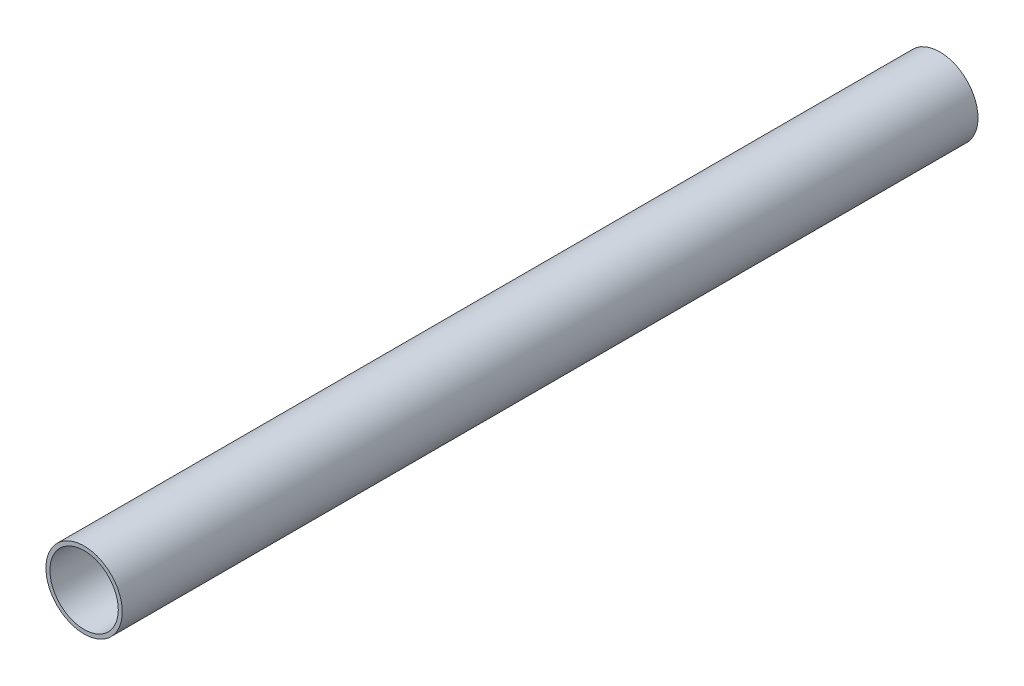
ISO-10303-21;
HEADER;
FILE_DESCRIPTION(('STEP AP214'),'2;1');
FILE_NAME('part.step','',(''),(''),'','','');
FILE_SCHEMA(('AUTOMOTIVE_DESIGN { 1 0 10303 214 1 1 1 1 }'));
ENDSEC;
DATA;
#1=APPLICATION_CONTEXT('core data for automotive mechanical design processes');
#2=APPLICATION_PROTOCOL_DEFINITION('international standard','automotive_design',2000,#1);
#3=PRODUCT_CONTEXT('',#1,'mechanical');
#4=PRODUCT('Part','Part','',(#3));
#5=PRODUCT_RELATED_PRODUCT_CATEGORY('part','',(#4));
#6=PRODUCT_DEFINITION_FORMATION('','',#4);
#7=PRODUCT_DEFINITION_CONTEXT('part definition',#1,'design');
#8=PRODUCT_DEFINITION('design','',#6,#7);
#9=PRODUCT_DEFINITION_SHAPE('','',#8);
#10=(LENGTH_UNIT() NAMED_UNIT(*) SI_UNIT(.MILLI.,.METRE.));
#11=(NAMED_UNIT(*) PLANE_ANGLE_UNIT() SI_UNIT($,.RADIAN.));
#12=(NAMED_UNIT(*) SI_UNIT($,.STERADIAN.) SOLID_ANGLE_UNIT());
#13=UNCERTAINTY_MEASURE_WITH_UNIT(LENGTH_MEASURE(1.E-05),#10,'distance_accuracy_value','');
#14=(GEOMETRIC_REPRESENTATION_CONTEXT(3) GLOBAL_UNCERTAINTY_ASSIGNED_CONTEXT((#13)) GLOBAL_UNIT_ASSIGNED_CONTEXT((#10,
#11,#12)) REPRESENTATION_CONTEXT('',''));
#15=CARTESIAN_POINT('',(0.,0.,0.));
#16=DIRECTION('',(0.,0.,1.));
#17=DIRECTION('',(1.,0.,0.));
#18=AXIS2_PLACEMENT_3D('',#15,#16,#17);
#19=CARTESIAN_POINT('',(0.,0.,356.));
#20=DIRECTION('',(0.,0.,1.));
#21=DIRECTION('',(1.,0.,0.));
#22=AXIS2_PLACEMENT_3D('',#19,#20,#21);
#23=PLANE('',#22);
#24=CARTESIAN_POINT('',(0.,0.,356.));
#25=DIRECTION('',(0.,0.,1.));
#26=DIRECTION('',(1.,0.,0.));
#27=AXIS2_PLACEMENT_3D('',#24,#25,#26);
#28=CIRCLE('',#27,15.875);
#29=CARTESIAN_POINT('',(15.875,0.,356.));
#30=VERTEX_POINT('',#29);
#31=EDGE_CURVE('E10',#30,#30,#28,.T.);
#32=ORIENTED_EDGE('',*,*,#31,.T.);
#33=EDGE_LOOP('',(#32));
#34=FACE_BOUND('',#33,.T.);
#35=CARTESIAN_POINT('',(0.,0.,356.));
#36=DIRECTION('',(0.,0.,1.));
#37=DIRECTION('',(1.,0.,0.));
#38=AXIS2_PLACEMENT_3D('',#35,#36,#37);
#39=CIRCLE('',#38,14.224);
#40=CARTESIAN_POINT('',(14.224,0.,356.));
#41=VERTEX_POINT('',#40);
#42=EDGE_CURVE('E41',#41,#41,#39,.T.);
#43=ORIENTED_EDGE('',*,*,#42,.F.);
#44=EDGE_LOOP('',(#43));
#45=FACE_BOUND('',#44,.T.);
#46=ADVANCED_FACE('F30',(#34,#45),#23,.T.);
#47=CARTESIAN_POINT('',(0.,0.,0.));
#48=DIRECTION('',(0.,0.,1.));
#49=DIRECTION('',(1.,0.,0.));
#50=AXIS2_PLACEMENT_3D('',#47,#48,#49);
#51=PLANE('',#50);
#52=CARTESIAN_POINT('',(0.,0.,0.));
#53=DIRECTION('',(0.,0.,1.));
#54=DIRECTION('',(1.,0.,0.));
#55=AXIS2_PLACEMENT_3D('',#52,#53,#54);
#56=CIRCLE('',#55,15.875);
#57=CARTESIAN_POINT('',(15.875,0.,0.));
#58=VERTEX_POINT('',#57);
#59=EDGE_CURVE('E34',#58,#58,#56,.T.);
#60=ORIENTED_EDGE('',*,*,#59,.F.);
#61=EDGE_LOOP('',(#60));
#62=FACE_BOUND('',#61,.T.);
#63=CARTESIAN_POINT('',(0.,0.,0.));
#64=DIRECTION('',(0.,0.,1.));
#65=DIRECTION('',(1.,0.,0.));
#66=AXIS2_PLACEMENT_3D('',#63,#64,#65);
#67=CIRCLE('',#66,14.224);
#68=CARTESIAN_POINT('',(14.224,0.,0.));
#69=VERTEX_POINT('',#68);
#70=EDGE_CURVE('E43',#69,#69,#67,.T.);
#71=ORIENTED_EDGE('',*,*,#70,.T.);
#72=EDGE_LOOP('',(#71));
#73=FACE_BOUND('',#72,.T.);
#74=ADVANCED_FACE('F53',(#62,#73),#51,.F.);
#75=CARTESIAN_POINT('',(0.,0.,356.));
#76=DIRECTION('',(0.,0.,-1.));
#77=DIRECTION('',(-1.,0.,0.));
#78=AXIS2_PLACEMENT_3D('',#75,#76,#77);
#79=CYLINDRICAL_SURFACE('',#78,15.875);
#80=ORIENTED_EDGE('',*,*,#31,.F.);
#81=EDGE_LOOP('',(#80));
#82=FACE_BOUND('',#81,.T.);
#83=ORIENTED_EDGE('',*,*,#59,.T.);
#84=EDGE_LOOP('',(#83));
#85=FACE_BOUND('',#84,.T.);
#86=ADVANCED_FACE('F32',(#82,#85),#79,.T.);
#87=CARTESIAN_POINT('',(0.,0.,356.));
#88=DIRECTION('',(0.,0.,-1.));
#89=DIRECTION('',(-1.,0.,0.));
#90=AXIS2_PLACEMENT_3D('',#87,#88,#89);
#91=CYLINDRICAL_SURFACE('',#90,14.224);
#92=ORIENTED_EDGE('',*,*,#42,.T.);
#93=EDGE_LOOP('',(#92));
#94=FACE_BOUND('',#93,.T.);
#95=ORIENTED_EDGE('',*,*,#70,.F.);
#96=EDGE_LOOP('',(#95));
#97=FACE_BOUND('',#96,.T.);
#98=ADVANCED_FACE('F49',(#94,#97),#91,.F.);
#99=CLOSED_SHELL('',(#46,#74,#86,#98));
#100=MANIFOLD_SOLID_BREP('B2',#99);
#101=ADVANCED_BREP_SHAPE_REPRESENTATION('',(#18,#100),#14);
#102=SHAPE_DEFINITION_REPRESENTATION(#9,#101);
ENDSEC;
END-ISO-10303-21;
